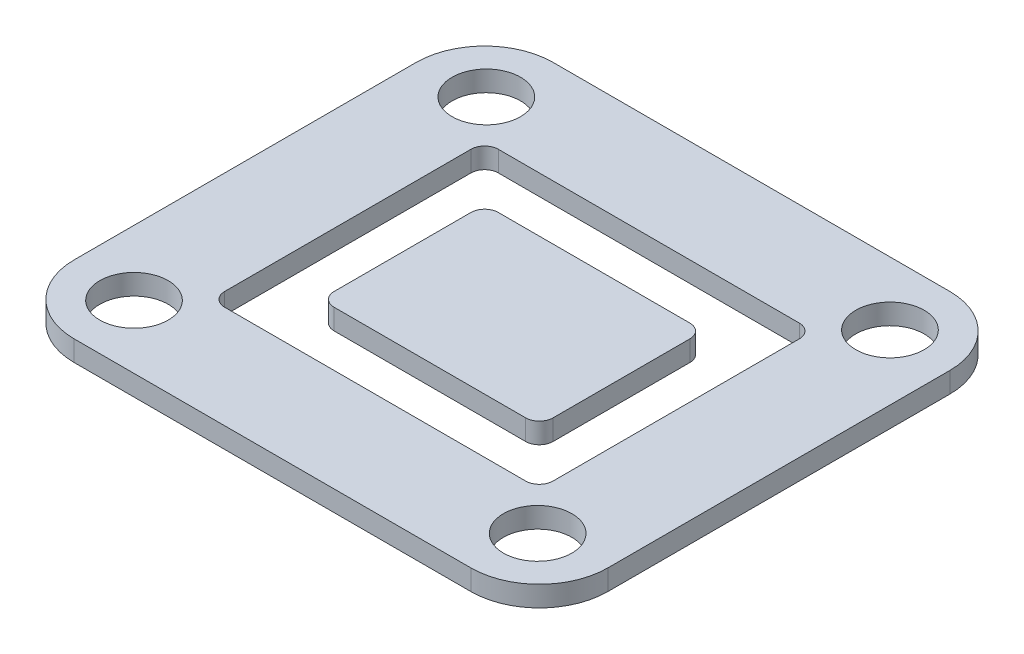
ISO-10303-21;
HEADER;
FILE_DESCRIPTION(('STEP AP214'),'2;1');
FILE_NAME('part.step','',(''),(''),'','','');
FILE_SCHEMA(('AUTOMOTIVE_DESIGN { 1 0 10303 214 1 1 1 1 }'));
ENDSEC;
DATA;
#1=APPLICATION_CONTEXT('core data for automotive mechanical design processes');
#2=APPLICATION_PROTOCOL_DEFINITION('international standard','automotive_design',2000,#1);
#3=PRODUCT_CONTEXT('',#1,'mechanical');
#4=PRODUCT('Part','Part','',(#3));
#5=PRODUCT_RELATED_PRODUCT_CATEGORY('part','',(#4));
#6=PRODUCT_DEFINITION_FORMATION('','',#4);
#7=PRODUCT_DEFINITION_CONTEXT('part definition',#1,'design');
#8=PRODUCT_DEFINITION('design','',#6,#7);
#9=PRODUCT_DEFINITION_SHAPE('','',#8);
#10=(LENGTH_UNIT() NAMED_UNIT(*) SI_UNIT(.MILLI.,.METRE.));
#11=(NAMED_UNIT(*) PLANE_ANGLE_UNIT() SI_UNIT($,.RADIAN.));
#12=(NAMED_UNIT(*) SI_UNIT($,.STERADIAN.) SOLID_ANGLE_UNIT());
#13=UNCERTAINTY_MEASURE_WITH_UNIT(LENGTH_MEASURE(1.E-05),#10,'distance_accuracy_value','');
#14=(GEOMETRIC_REPRESENTATION_CONTEXT(3) GLOBAL_UNCERTAINTY_ASSIGNED_CONTEXT((#13)) GLOBAL_UNIT_ASSIGNED_CONTEXT((#10,
#11,#12)) REPRESENTATION_CONTEXT('',''));
#15=CARTESIAN_POINT('',(0.,0.,0.));
#16=DIRECTION('',(0.,0.,1.));
#17=DIRECTION('',(1.,0.,0.));
#18=AXIS2_PLACEMENT_3D('',#15,#16,#17);
#19=CARTESIAN_POINT('',(0.,3.,-16.9501900989278));
#20=DIRECTION('',(0.,0.,1.));
#21=DIRECTION('',(1.,0.,0.));
#22=AXIS2_PLACEMENT_3D('',#19,#20,#21);
#23=PLANE('',#22);
#24=DIRECTION('',(-1.,0.,0.));
#25=VECTOR('',#24,1.);
#26=CARTESIAN_POINT('',(0.,0.,-16.9501900989278));
#27=LINE('',#26,#25);
#28=CARTESIAN_POINT('',(13.9246009024166,0.,-16.9501900989278));
#29=VERTEX_POINT('',#28);
#30=CARTESIAN_POINT('',(-14.0753990975834,0.,-16.9501900989278));
#31=VERTEX_POINT('',#30);
#32=EDGE_CURVE('E193',#29,#31,#27,.T.);
#33=ORIENTED_EDGE('',*,*,#32,.T.);
#34=DIRECTION('',(0.,-1.,0.));
#35=VECTOR('',#34,1.);
#36=CARTESIAN_POINT('',(-14.0753990975834,3.,-16.9501900989278));
#37=LINE('',#36,#35);
#38=CARTESIAN_POINT('',(-14.0753990975834,3.,-16.9501900989278));
#39=VERTEX_POINT('',#38);
#40=EDGE_CURVE('E180',#31,#39,#37,.F.);
#41=ORIENTED_EDGE('',*,*,#40,.T.);
#42=DIRECTION('',(-1.,0.,0.));
#43=VECTOR('',#42,1.);
#44=CARTESIAN_POINT('',(0.,3.,-16.9501900989278));
#45=LINE('',#44,#43);
#46=CARTESIAN_POINT('',(13.9246009024166,3.,-16.9501900989278));
#47=VERTEX_POINT('',#46);
#48=EDGE_CURVE('E195',#47,#39,#45,.T.);
#49=ORIENTED_EDGE('',*,*,#48,.F.);
#50=DIRECTION('',(0.,-1.,0.));
#51=VECTOR('',#50,1.);
#52=CARTESIAN_POINT('',(13.9246009024166,0.,-16.9501900989278));
#53=LINE('',#52,#51);
#54=EDGE_CURVE('E177',#47,#29,#53,.T.);
#55=ORIENTED_EDGE('',*,*,#54,.T.);
#56=EDGE_LOOP('',(#33,#41,#49,#55));
#57=FACE_BOUND('',#56,.T.);
#58=ADVANCED_FACE('F68',(#57),#23,.F.);
#59=CARTESIAN_POINT('',(-16.0753990975834,3.,0.));
#60=DIRECTION('',(1.,0.,0.));
#61=DIRECTION('',(0.,0.,-1.));
#62=AXIS2_PLACEMENT_3D('',#59,#60,#61);
#63=PLANE('',#62);
#64=DIRECTION('',(0.,0.,1.));
#65=VECTOR('',#64,1.);
#66=CARTESIAN_POINT('',(-16.0753990975834,0.,0.));
#67=LINE('',#66,#65);
#68=CARTESIAN_POINT('',(-16.0753990975834,0.,-14.9501900989278));
#69=VERTEX_POINT('',#68);
#70=CARTESIAN_POINT('',(-16.0753990975834,0.,5.0498099010722));
#71=VERTEX_POINT('',#70);
#72=EDGE_CURVE('E151',#69,#71,#67,.T.);
#73=ORIENTED_EDGE('',*,*,#72,.T.);
#74=DIRECTION('',(0.,-1.,0.));
#75=VECTOR('',#74,1.);
#76=CARTESIAN_POINT('',(-16.0753990975834,3.,5.0498099010722));
#77=LINE('',#76,#75);
#78=CARTESIAN_POINT('',(-16.0753990975834,3.,5.0498099010722));
#79=VERTEX_POINT('',#78);
#80=EDGE_CURVE('E168',#71,#79,#77,.F.);
#81=ORIENTED_EDGE('',*,*,#80,.T.);
#82=DIRECTION('',(0.,0.,1.));
#83=VECTOR('',#82,1.);
#84=CARTESIAN_POINT('',(-16.0753990975834,3.,0.));
#85=LINE('',#84,#83);
#86=CARTESIAN_POINT('',(-16.0753990975834,3.,-14.9501900989278));
#87=VERTEX_POINT('',#86);
#88=EDGE_CURVE('E202',#87,#79,#85,.T.);
#89=ORIENTED_EDGE('',*,*,#88,.F.);
#90=DIRECTION('',(0.,-1.,0.));
#91=VECTOR('',#90,1.);
#92=CARTESIAN_POINT('',(-16.0753990975834,3.,-14.9501900989278));
#93=LINE('',#92,#91);
#94=EDGE_CURVE('E165',#87,#69,#93,.T.);
#95=ORIENTED_EDGE('',*,*,#94,.T.);
#96=EDGE_LOOP('',(#73,#81,#89,#95));
#97=FACE_BOUND('',#96,.T.);
#98=ADVANCED_FACE('F210',(#97),#63,.F.);
#99=CARTESIAN_POINT('',(0.,3.,7.0498099010722));
#100=DIRECTION('',(0.,0.,1.));
#101=DIRECTION('',(1.,0.,0.));
#102=AXIS2_PLACEMENT_3D('',#99,#100,#101);
#103=PLANE('',#102);
#104=DIRECTION('',(-1.,0.,0.));
#105=VECTOR('',#104,1.);
#106=CARTESIAN_POINT('',(0.,3.,7.0498099010722));
#107=LINE('',#106,#105);
#108=CARTESIAN_POINT('',(13.9246009024166,3.,7.04980990107219));
#109=VERTEX_POINT('',#108);
#110=CARTESIAN_POINT('',(-14.0753990975834,3.,7.0498099010722));
#111=VERTEX_POINT('',#110);
#112=EDGE_CURVE('E156',#109,#111,#107,.T.);
#113=ORIENTED_EDGE('',*,*,#112,.T.);
#114=DIRECTION('',(0.,-1.,0.));
#115=VECTOR('',#114,1.);
#116=CARTESIAN_POINT('',(-14.0753990975834,0.,7.0498099010722));
#117=LINE('',#116,#115);
#118=CARTESIAN_POINT('',(-14.0753990975834,0.,7.0498099010722));
#119=VERTEX_POINT('',#118);
#120=EDGE_CURVE('E143',#111,#119,#117,.T.);
#121=ORIENTED_EDGE('',*,*,#120,.T.);
#122=DIRECTION('',(-1.,0.,0.));
#123=VECTOR('',#122,1.);
#124=CARTESIAN_POINT('',(0.,0.,7.0498099010722));
#125=LINE('',#124,#123);
#126=CARTESIAN_POINT('',(13.9246009024166,0.,7.04980990107219));
#127=VERTEX_POINT('',#126);
#128=EDGE_CURVE('E136',#127,#119,#125,.T.);
#129=ORIENTED_EDGE('',*,*,#128,.F.);
#130=DIRECTION('',(0.,-1.,0.));
#131=VECTOR('',#130,1.);
#132=CARTESIAN_POINT('',(13.9246009024166,3.,7.04980990107219));
#133=LINE('',#132,#131);
#134=EDGE_CURVE('E149',#127,#109,#133,.F.);
#135=ORIENTED_EDGE('',*,*,#134,.T.);
#136=EDGE_LOOP('',(#113,#121,#129,#135));
#137=FACE_BOUND('',#136,.T.);
#138=ADVANCED_FACE('F148',(#137),#103,.T.);
#139=CARTESIAN_POINT('',(15.9246009024166,3.,0.));
#140=DIRECTION('',(1.,0.,0.));
#141=DIRECTION('',(0.,0.,-1.));
#142=AXIS2_PLACEMENT_3D('',#139,#140,#141);
#143=PLANE('',#142);
#144=DIRECTION('',(0.,0.,1.));
#145=VECTOR('',#144,1.);
#146=CARTESIAN_POINT('',(15.9246009024166,0.,0.));
#147=LINE('',#146,#145);
#148=CARTESIAN_POINT('',(15.9246009024166,0.,-14.9501900989278));
#149=VERTEX_POINT('',#148);
#150=CARTESIAN_POINT('',(15.9246009024166,0.,5.04980990107219));
#151=VERTEX_POINT('',#150);
#152=EDGE_CURVE('E137',#149,#151,#147,.T.);
#153=ORIENTED_EDGE('',*,*,#152,.F.);
#154=DIRECTION('',(0.,-1.,0.));
#155=VECTOR('',#154,1.);
#156=CARTESIAN_POINT('',(15.9246009024166,3.,-14.9501900989278));
#157=LINE('',#156,#155);
#158=CARTESIAN_POINT('',(15.9246009024166,3.,-14.9501900989278));
#159=VERTEX_POINT('',#158);
#160=EDGE_CURVE('E13',#149,#159,#157,.F.);
#161=ORIENTED_EDGE('',*,*,#160,.T.);
#162=DIRECTION('',(0.,0.,1.));
#163=VECTOR('',#162,1.);
#164=CARTESIAN_POINT('',(15.9246009024166,3.,0.));
#165=LINE('',#164,#163);
#166=CARTESIAN_POINT('',(15.9246009024166,3.,5.04980990107219));
#167=VERTEX_POINT('',#166);
#168=EDGE_CURVE('E153',#159,#167,#165,.T.);
#169=ORIENTED_EDGE('',*,*,#168,.T.);
#170=DIRECTION('',(0.,-1.,0.));
#171=VECTOR('',#170,1.);
#172=CARTESIAN_POINT('',(15.9246009024166,3.,5.04980990107219));
#173=LINE('',#172,#171);
#174=EDGE_CURVE('E76',#167,#151,#173,.T.);
#175=ORIENTED_EDGE('',*,*,#174,.T.);
#176=EDGE_LOOP('',(#153,#161,#169,#175));
#177=FACE_BOUND('',#176,.T.);
#178=ADVANCED_FACE('F181',(#177),#143,.T.);
#179=CARTESIAN_POINT('',(0.,3.,0.));
#180=DIRECTION('',(0.,1.,0.));
#181=DIRECTION('',(0.,0.,1.));
#182=AXIS2_PLACEMENT_3D('',#179,#180,#181);
#183=PLANE('',#182);
#184=ORIENTED_EDGE('',*,*,#88,.T.);
#185=CARTESIAN_POINT('',(-14.0753990975834,3.,5.0498099010722));
#186=DIRECTION('',(0.,1.,0.));
#187=DIRECTION('',(0.,0.,1.));
#188=AXIS2_PLACEMENT_3D('',#185,#186,#187);
#189=CIRCLE('',#188,2.);
#190=EDGE_CURVE('E175',#79,#111,#189,.T.);
#191=ORIENTED_EDGE('',*,*,#190,.T.);
#192=ORIENTED_EDGE('',*,*,#112,.F.);
#193=CARTESIAN_POINT('',(13.9246009024166,3.,5.04980990107219));
#194=DIRECTION('',(0.,1.,0.));
#195=DIRECTION('',(0.,0.,1.));
#196=AXIS2_PLACEMENT_3D('',#193,#194,#195);
#197=CIRCLE('',#196,2.);
#198=EDGE_CURVE('E83',#109,#167,#197,.T.);
#199=ORIENTED_EDGE('',*,*,#198,.T.);
#200=ORIENTED_EDGE('',*,*,#168,.F.);
#201=CARTESIAN_POINT('',(13.9246009024166,3.,-14.9501900989278));
#202=DIRECTION('',(0.,1.,0.));
#203=DIRECTION('',(0.,0.,1.));
#204=AXIS2_PLACEMENT_3D('',#201,#202,#203);
#205=CIRCLE('',#204,2.);
#206=EDGE_CURVE('E171',#159,#47,#205,.T.);
#207=ORIENTED_EDGE('',*,*,#206,.T.);
#208=ORIENTED_EDGE('',*,*,#48,.T.);
#209=CARTESIAN_POINT('',(-14.0753990975834,3.,-14.9501900989278));
#210=DIRECTION('',(0.,1.,0.));
#211=DIRECTION('',(0.,0.,1.));
#212=AXIS2_PLACEMENT_3D('',#209,#210,#211);
#213=CIRCLE('',#212,2.);
#214=EDGE_CURVE('E173',#39,#87,#213,.T.);
#215=ORIENTED_EDGE('',*,*,#214,.T.);
#216=EDGE_LOOP('',(#184,#191,#192,#199,#200,#207,#208,#215));
#217=FACE_BOUND('',#216,.T.);
#218=ADVANCED_FACE('F184',(#217),#183,.T.);
#219=CARTESIAN_POINT('',(0.,0.,0.));
#220=DIRECTION('',(0.,1.,0.));
#221=DIRECTION('',(0.,0.,1.));
#222=AXIS2_PLACEMENT_3D('',#219,#220,#221);
#223=PLANE('',#222);
#224=ORIENTED_EDGE('',*,*,#128,.T.);
#225=CARTESIAN_POINT('',(-14.0753990975834,0.,5.0498099010722));
#226=DIRECTION('',(0.,1.,0.));
#227=DIRECTION('',(0.,0.,1.));
#228=AXIS2_PLACEMENT_3D('',#225,#226,#227);
#229=CIRCLE('',#228,2.);
#230=EDGE_CURVE('E163',#119,#71,#229,.F.);
#231=ORIENTED_EDGE('',*,*,#230,.T.);
#232=ORIENTED_EDGE('',*,*,#72,.F.);
#233=CARTESIAN_POINT('',(-14.0753990975834,0.,-14.9501900989278));
#234=DIRECTION('',(0.,1.,0.));
#235=DIRECTION('',(0.,0.,1.));
#236=AXIS2_PLACEMENT_3D('',#233,#234,#235);
#237=CIRCLE('',#236,2.);
#238=EDGE_CURVE('E161',#69,#31,#237,.F.);
#239=ORIENTED_EDGE('',*,*,#238,.T.);
#240=ORIENTED_EDGE('',*,*,#32,.F.);
#241=CARTESIAN_POINT('',(13.9246009024166,0.,-14.9501900989278));
#242=DIRECTION('',(0.,1.,0.));
#243=DIRECTION('',(0.,0.,1.));
#244=AXIS2_PLACEMENT_3D('',#241,#242,#243);
#245=CIRCLE('',#244,2.);
#246=EDGE_CURVE('E142',#29,#149,#245,.F.);
#247=ORIENTED_EDGE('',*,*,#246,.T.);
#248=ORIENTED_EDGE('',*,*,#152,.T.);
#249=CARTESIAN_POINT('',(13.9246009024166,0.,5.04980990107219));
#250=DIRECTION('',(0.,1.,0.));
#251=DIRECTION('',(0.,0.,1.));
#252=AXIS2_PLACEMENT_3D('',#249,#250,#251);
#253=CIRCLE('',#252,2.);
#254=EDGE_CURVE('E133',#151,#127,#253,.F.);
#255=ORIENTED_EDGE('',*,*,#254,.T.);
#256=EDGE_LOOP('',(#224,#231,#232,#239,#240,#247,#248,#255));
#257=FACE_BOUND('',#256,.T.);
#258=ADVANCED_FACE('F135',(#257),#223,.F.);
#259=CARTESIAN_POINT('',(-14.0753990975834,3.,5.0498099010722));
#260=DIRECTION('',(0.,1.,0.));
#261=DIRECTION('',(0.,0.,1.));
#262=AXIS2_PLACEMENT_3D('',#259,#260,#261);
#263=CYLINDRICAL_SURFACE('',#262,2.);
#264=ORIENTED_EDGE('',*,*,#190,.F.);
#265=ORIENTED_EDGE('',*,*,#80,.F.);
#266=ORIENTED_EDGE('',*,*,#230,.F.);
#267=ORIENTED_EDGE('',*,*,#120,.F.);
#268=EDGE_LOOP('',(#264,#265,#266,#267));
#269=FACE_BOUND('',#268,.T.);
#270=ADVANCED_FACE('F214',(#269),#263,.T.);
#271=CARTESIAN_POINT('',(-14.0753990975834,3.,-14.9501900989278));
#272=DIRECTION('',(0.,-1.,0.));
#273=DIRECTION('',(0.,0.,-1.));
#274=AXIS2_PLACEMENT_3D('',#271,#272,#273);
#275=CYLINDRICAL_SURFACE('',#274,2.);
#276=ORIENTED_EDGE('',*,*,#214,.F.);
#277=ORIENTED_EDGE('',*,*,#40,.F.);
#278=ORIENTED_EDGE('',*,*,#238,.F.);
#279=ORIENTED_EDGE('',*,*,#94,.F.);
#280=EDGE_LOOP('',(#276,#277,#278,#279));
#281=FACE_BOUND('',#280,.T.);
#282=ADVANCED_FACE('F208',(#281),#275,.T.);
#283=CARTESIAN_POINT('',(13.9246009024166,3.,-14.9501900989278));
#284=DIRECTION('',(0.,1.,0.));
#285=DIRECTION('',(0.,0.,1.));
#286=AXIS2_PLACEMENT_3D('',#283,#284,#285);
#287=CYLINDRICAL_SURFACE('',#286,2.);
#288=ORIENTED_EDGE('',*,*,#206,.F.);
#289=ORIENTED_EDGE('',*,*,#160,.F.);
#290=ORIENTED_EDGE('',*,*,#246,.F.);
#291=ORIENTED_EDGE('',*,*,#54,.F.);
#292=EDGE_LOOP('',(#288,#289,#290,#291));
#293=FACE_BOUND('',#292,.T.);
#294=ADVANCED_FACE('F189',(#293),#287,.T.);
#295=CARTESIAN_POINT('',(13.9246009024166,3.,5.04980990107219));
#296=DIRECTION('',(0.,-1.,0.));
#297=DIRECTION('',(0.,0.,-1.));
#298=AXIS2_PLACEMENT_3D('',#295,#296,#297);
#299=CYLINDRICAL_SURFACE('',#298,2.);
#300=ORIENTED_EDGE('',*,*,#198,.F.);
#301=ORIENTED_EDGE('',*,*,#134,.F.);
#302=ORIENTED_EDGE('',*,*,#254,.F.);
#303=ORIENTED_EDGE('',*,*,#174,.F.);
#304=EDGE_LOOP('',(#300,#301,#302,#303));
#305=FACE_BOUND('',#304,.T.);
#306=ADVANCED_FACE('F70',(#305),#299,.T.);
#307=CLOSED_SHELL('',(#58,#98,#138,#178,#218,#258,#270,#282,#294,#306));
#308=MANIFOLD_SOLID_BREP('B2',#307);
#309=CARTESIAN_POINT('',(0.,3.,-24.9501900989278));
#310=DIRECTION('',(0.,0.,-1.));
#311=DIRECTION('',(-1.,0.,0.));
#312=AXIS2_PLACEMENT_3D('',#309,#310,#311);
#313=PLANE('',#312);
#314=DIRECTION('',(1.,0.,0.));
#315=VECTOR('',#314,1.);
#316=CARTESIAN_POINT('',(0.,0.,-24.9501900989278));
#317=LINE('',#316,#315);
#318=CARTESIAN_POINT('',(-22.0753990975834,0.,-24.9501900989278));
#319=VERTEX_POINT('',#318);
#320=CARTESIAN_POINT('',(21.9246009024166,0.,-24.9501900989278));
#321=VERTEX_POINT('',#320);
#322=EDGE_CURVE('E414',#319,#321,#317,.T.);
#323=ORIENTED_EDGE('',*,*,#322,.T.);
#324=DIRECTION('',(0.,-1.,0.));
#325=VECTOR('',#324,1.);
#326=CARTESIAN_POINT('',(21.9246009024166,3.,-24.9501900989278));
#327=LINE('',#326,#325);
#328=CARTESIAN_POINT('',(21.9246009024166,3.,-24.9501900989278));
#329=VERTEX_POINT('',#328);
#330=EDGE_CURVE('E454',#321,#329,#327,.F.);
#331=ORIENTED_EDGE('',*,*,#330,.T.);
#332=DIRECTION('',(1.,0.,0.));
#333=VECTOR('',#332,1.);
#334=CARTESIAN_POINT('',(0.,3.,-24.9501900989278));
#335=LINE('',#334,#333);
#336=CARTESIAN_POINT('',(-22.0753990975834,3.,-24.9501900989278));
#337=VERTEX_POINT('',#336);
#338=EDGE_CURVE('E547',#337,#329,#335,.T.);
#339=ORIENTED_EDGE('',*,*,#338,.F.);
#340=DIRECTION('',(0.,-1.,0.));
#341=VECTOR('',#340,1.);
#342=CARTESIAN_POINT('',(-22.0753990975834,3.,-24.9501900989278));
#343=LINE('',#342,#341);
#344=EDGE_CURVE('E452',#337,#319,#343,.T.);
#345=ORIENTED_EDGE('',*,*,#344,.T.);
#346=EDGE_LOOP('',(#323,#331,#339,#345));
#347=FACE_BOUND('',#346,.T.);
#348=ADVANCED_FACE('F295',(#347),#313,.F.);
#349=CARTESIAN_POINT('',(23.9246009024166,3.,0.));
#350=DIRECTION('',(1.,0.,0.));
#351=DIRECTION('',(0.,0.,-1.));
#352=AXIS2_PLACEMENT_3D('',#349,#350,#351);
#353=PLANE('',#352);
#354=DIRECTION('',(0.,0.,1.));
#355=VECTOR('',#354,1.);
#356=CARTESIAN_POINT('',(23.9246009024166,0.,0.));
#357=LINE('',#356,#355);
#358=CARTESIAN_POINT('',(23.9246009024166,0.,-22.9501900989278));
#359=VERTEX_POINT('',#358);
#360=CARTESIAN_POINT('',(23.9246009024166,0.,13.0498099010722));
#361=VERTEX_POINT('',#360);
#362=EDGE_CURVE('E527',#359,#361,#357,.T.);
#363=ORIENTED_EDGE('',*,*,#362,.T.);
#364=DIRECTION('',(0.,-1.,0.));
#365=VECTOR('',#364,1.);
#366=CARTESIAN_POINT('',(23.9246009024166,3.,13.0498099010722));
#367=LINE('',#366,#365);
#368=CARTESIAN_POINT('',(23.9246009024166,3.,13.0498099010722));
#369=VERTEX_POINT('',#368);
#370=EDGE_CURVE('E450',#361,#369,#367,.F.);
#371=ORIENTED_EDGE('',*,*,#370,.T.);
#372=DIRECTION('',(0.,0.,1.));
#373=VECTOR('',#372,1.);
#374=CARTESIAN_POINT('',(23.9246009024166,3.,0.));
#375=LINE('',#374,#373);
#376=CARTESIAN_POINT('',(23.9246009024166,3.,-22.9501900989278));
#377=VERTEX_POINT('',#376);
#378=EDGE_CURVE('E545',#377,#369,#375,.T.);
#379=ORIENTED_EDGE('',*,*,#378,.F.);
#380=DIRECTION('',(0.,-1.,0.));
#381=VECTOR('',#380,1.);
#382=CARTESIAN_POINT('',(23.9246009024166,0.,-22.9501900989278));
#383=LINE('',#382,#381);
#384=EDGE_CURVE('E447',#377,#359,#383,.T.);
#385=ORIENTED_EDGE('',*,*,#384,.T.);
#386=EDGE_LOOP('',(#363,#371,#379,#385));
#387=FACE_BOUND('',#386,.T.);
#388=ADVANCED_FACE('F579',(#387),#353,.F.);
#389=CARTESIAN_POINT('',(0.,3.,15.0498099010722));
#390=DIRECTION('',(0.,0.,-1.));
#391=DIRECTION('',(-1.,0.,0.));
#392=AXIS2_PLACEMENT_3D('',#389,#390,#391);
#393=PLANE('',#392);
#394=DIRECTION('',(1.,0.,0.));
#395=VECTOR('',#394,1.);
#396=CARTESIAN_POINT('',(0.,0.,15.0498099010722));
#397=LINE('',#396,#395);
#398=CARTESIAN_POINT('',(-22.0753990975834,0.,15.0498099010722));
#399=VERTEX_POINT('',#398);
#400=CARTESIAN_POINT('',(21.9246009024166,0.,15.0498099010722));
#401=VERTEX_POINT('',#400);
#402=EDGE_CURVE('E431',#399,#401,#397,.T.);
#403=ORIENTED_EDGE('',*,*,#402,.F.);
#404=DIRECTION('',(0.,-1.,0.));
#405=VECTOR('',#404,1.);
#406=CARTESIAN_POINT('',(-22.0753990975834,3.,15.0498099010722));
#407=LINE('',#406,#405);
#408=CARTESIAN_POINT('',(-22.0753990975834,3.,15.0498099010722));
#409=VERTEX_POINT('',#408);
#410=EDGE_CURVE('E445',#399,#409,#407,.F.);
#411=ORIENTED_EDGE('',*,*,#410,.T.);
#412=DIRECTION('',(1.,0.,0.));
#413=VECTOR('',#412,1.);
#414=CARTESIAN_POINT('',(0.,3.,15.0498099010722));
#415=LINE('',#414,#413);
#416=CARTESIAN_POINT('',(21.9246009024166,3.,15.0498099010722));
#417=VERTEX_POINT('',#416);
#418=EDGE_CURVE('E439',#409,#417,#415,.T.);
#419=ORIENTED_EDGE('',*,*,#418,.T.);
#420=DIRECTION('',(0.,-1.,0.));
#421=VECTOR('',#420,1.);
#422=CARTESIAN_POINT('',(21.9246009024166,3.,15.0498099010722));
#423=LINE('',#422,#421);
#424=EDGE_CURVE('E437',#417,#401,#423,.T.);
#425=ORIENTED_EDGE('',*,*,#424,.T.);
#426=EDGE_LOOP('',(#403,#411,#419,#425));
#427=FACE_BOUND('',#426,.T.);
#428=ADVANCED_FACE('F534',(#427),#393,.T.);
#429=CARTESIAN_POINT('',(38.9246009024166,3.,0.));
#430=DIRECTION('',(1.,0.,0.));
#431=DIRECTION('',(0.,0.,-1.));
#432=AXIS2_PLACEMENT_3D('',#429,#430,#431);
#433=PLANE('',#432);
#434=DIRECTION('',(0.,0.,1.));
#435=VECTOR('',#434,1.);
#436=CARTESIAN_POINT('',(38.9246009024166,0.,0.));
#437=LINE('',#436,#435);
#438=CARTESIAN_POINT('',(38.9246009024166,0.,-29.9501900989278));
#439=VERTEX_POINT('',#438);
#440=CARTESIAN_POINT('',(38.9246009024166,0.,20.0498099010722));
#441=VERTEX_POINT('',#440);
#442=EDGE_CURVE('E503',#439,#441,#437,.T.);
#443=ORIENTED_EDGE('',*,*,#442,.F.);
#444=DIRECTION('',(0.,-1.,0.));
#445=VECTOR('',#444,1.);
#446=CARTESIAN_POINT('',(38.9246009024166,3.,-29.9501900989278));
#447=LINE('',#446,#445);
#448=CARTESIAN_POINT('',(38.9246009024166,3.,-29.9501900989278));
#449=VERTEX_POINT('',#448);
#450=EDGE_CURVE('E66',#439,#449,#447,.F.);
#451=ORIENTED_EDGE('',*,*,#450,.T.);
#452=DIRECTION('',(0.,0.,1.));
#453=VECTOR('',#452,1.);
#454=CARTESIAN_POINT('',(38.9246009024166,3.,0.));
#455=LINE('',#454,#453);
#456=CARTESIAN_POINT('',(38.9246009024166,3.,20.0498099010722));
#457=VERTEX_POINT('',#456);
#458=EDGE_CURVE('E505',#449,#457,#455,.T.);
#459=ORIENTED_EDGE('',*,*,#458,.T.);
#460=DIRECTION('',(0.,-1.,0.));
#461=VECTOR('',#460,1.);
#462=CARTESIAN_POINT('',(38.9246009024166,0.,20.0498099010722));
#463=LINE('',#462,#461);
#464=EDGE_CURVE('E303',#457,#441,#463,.T.);
#465=ORIENTED_EDGE('',*,*,#464,.T.);
#466=EDGE_LOOP('',(#443,#451,#459,#465));
#467=FACE_BOUND('',#466,.T.);
#468=ADVANCED_FACE('F502',(#467),#433,.T.);
#469=CARTESIAN_POINT('',(0.,3.,-39.9501900989278));
#470=DIRECTION('',(0.,0.,-1.));
#471=DIRECTION('',(-1.,0.,0.));
#472=AXIS2_PLACEMENT_3D('',#469,#470,#471);
#473=PLANE('',#472);
#474=DIRECTION('',(1.,0.,0.));
#475=VECTOR('',#474,1.);
#476=CARTESIAN_POINT('',(0.,0.,-39.9501900989278));
#477=LINE('',#476,#475);
#478=CARTESIAN_POINT('',(-29.0753990975834,0.,-39.9501900989278));
#479=VERTEX_POINT('',#478);
#480=CARTESIAN_POINT('',(28.9246009024166,0.,-39.9501900989278));
#481=VERTEX_POINT('',#480);
#482=EDGE_CURVE('E512',#479,#481,#477,.T.);
#483=ORIENTED_EDGE('',*,*,#482,.F.);
#484=DIRECTION('',(0.,-1.,0.));
#485=VECTOR('',#484,1.);
#486=CARTESIAN_POINT('',(-29.0753990975834,3.,-39.9501900989278));
#487=LINE('',#486,#485);
#488=CARTESIAN_POINT('',(-29.0753990975834,3.,-39.9501900989278));
#489=VERTEX_POINT('',#488);
#490=EDGE_CURVE('E317',#479,#489,#487,.F.);
#491=ORIENTED_EDGE('',*,*,#490,.T.);
#492=DIRECTION('',(1.,0.,0.));
#493=VECTOR('',#492,1.);
#494=CARTESIAN_POINT('',(0.,3.,-39.9501900989278));
#495=LINE('',#494,#493);
#496=CARTESIAN_POINT('',(28.9246009024166,3.,-39.9501900989278));
#497=VERTEX_POINT('',#496);
#498=EDGE_CURVE('E637',#489,#497,#495,.T.);
#499=ORIENTED_EDGE('',*,*,#498,.T.);
#500=DIRECTION('',(0.,-1.,0.));
#501=VECTOR('',#500,1.);
#502=CARTESIAN_POINT('',(28.9246009024166,3.,-39.9501900989278));
#503=LINE('',#502,#501);
#504=EDGE_CURVE('E493',#497,#481,#503,.T.);
#505=ORIENTED_EDGE('',*,*,#504,.T.);
#506=EDGE_LOOP('',(#483,#491,#499,#505));
#507=FACE_BOUND('',#506,.T.);
#508=ADVANCED_FACE('F595',(#507),#473,.T.);
#509=CARTESIAN_POINT('',(-39.0753990975834,3.,0.));
#510=DIRECTION('',(1.,0.,0.));
#511=DIRECTION('',(0.,0.,-1.));
#512=AXIS2_PLACEMENT_3D('',#509,#510,#511);
#513=PLANE('',#512);
#514=DIRECTION('',(0.,0.,1.));
#515=VECTOR('',#514,1.);
#516=CARTESIAN_POINT('',(-39.0753990975834,0.,0.));
#517=LINE('',#516,#515);
#518=CARTESIAN_POINT('',(-39.0753990975834,0.,-29.9501900989278));
#519=VERTEX_POINT('',#518);
#520=CARTESIAN_POINT('',(-39.0753990975834,0.,20.0498099010722));
#521=VERTEX_POINT('',#520);
#522=EDGE_CURVE('E515',#519,#521,#517,.T.);
#523=ORIENTED_EDGE('',*,*,#522,.T.);
#524=DIRECTION('',(0.,-1.,0.));
#525=VECTOR('',#524,1.);
#526=CARTESIAN_POINT('',(-39.0753990975834,3.,20.0498099010722));
#527=LINE('',#526,#525);
#528=CARTESIAN_POINT('',(-39.0753990975834,3.,20.0498099010722));
#529=VERTEX_POINT('',#528);
#530=EDGE_CURVE('E484',#521,#529,#527,.F.);
#531=ORIENTED_EDGE('',*,*,#530,.T.);
#532=DIRECTION('',(0.,0.,1.));
#533=VECTOR('',#532,1.);
#534=CARTESIAN_POINT('',(-39.0753990975834,3.,0.));
#535=LINE('',#534,#533);
#536=CARTESIAN_POINT('',(-39.0753990975834,3.,-29.9501900989278));
#537=VERTEX_POINT('',#536);
#538=EDGE_CURVE('E630',#537,#529,#535,.T.);
#539=ORIENTED_EDGE('',*,*,#538,.F.);
#540=DIRECTION('',(0.,-1.,0.));
#541=VECTOR('',#540,1.);
#542=CARTESIAN_POINT('',(-39.0753990975834,0.,-29.9501900989278));
#543=LINE('',#542,#541);
#544=EDGE_CURVE('E481',#537,#519,#543,.T.);
#545=ORIENTED_EDGE('',*,*,#544,.T.);
#546=EDGE_LOOP('',(#523,#531,#539,#545));
#547=FACE_BOUND('',#546,.T.);
#548=ADVANCED_FACE('F591',(#547),#513,.F.);
#549=CARTESIAN_POINT('',(0.,3.,30.0498099010722));
#550=DIRECTION('',(0.,0.,-1.));
#551=DIRECTION('',(-1.,0.,0.));
#552=AXIS2_PLACEMENT_3D('',#549,#550,#551);
#553=PLANE('',#552);
#554=DIRECTION('',(1.,0.,0.));
#555=VECTOR('',#554,1.);
#556=CARTESIAN_POINT('',(0.,3.,30.0498099010722));
#557=LINE('',#556,#555);
#558=CARTESIAN_POINT('',(-29.0753990975834,3.,30.0498099010722));
#559=VERTEX_POINT('',#558);
#560=CARTESIAN_POINT('',(28.9246009024166,3.,30.0498099010722));
#561=VERTEX_POINT('',#560);
#562=EDGE_CURVE('E636',#559,#561,#557,.T.);
#563=ORIENTED_EDGE('',*,*,#562,.F.);
#564=DIRECTION('',(0.,-1.,0.));
#565=VECTOR('',#564,1.);
#566=CARTESIAN_POINT('',(-29.0753990975834,3.,30.0498099010722));
#567=LINE('',#566,#565);
#568=CARTESIAN_POINT('',(-29.0753990975834,0.,30.0498099010722));
#569=VERTEX_POINT('',#568);
#570=EDGE_CURVE('E470',#559,#569,#567,.T.);
#571=ORIENTED_EDGE('',*,*,#570,.T.);
#572=DIRECTION('',(1.,0.,0.));
#573=VECTOR('',#572,1.);
#574=CARTESIAN_POINT('',(0.,0.,30.0498099010722));
#575=LINE('',#574,#573);
#576=CARTESIAN_POINT('',(28.9246009024166,0.,30.0498099010722));
#577=VERTEX_POINT('',#576);
#578=EDGE_CURVE('E524',#569,#577,#575,.T.);
#579=ORIENTED_EDGE('',*,*,#578,.T.);
#580=DIRECTION('',(0.,-1.,0.));
#581=VECTOR('',#580,1.);
#582=CARTESIAN_POINT('',(28.9246009024166,3.,30.0498099010722));
#583=LINE('',#582,#581);
#584=EDGE_CURVE('E468',#577,#561,#583,.F.);
#585=ORIENTED_EDGE('',*,*,#584,.T.);
#586=EDGE_LOOP('',(#563,#571,#579,#585));
#587=FACE_BOUND('',#586,.T.);
#588=ADVANCED_FACE('F574',(#587),#553,.F.);
#589=CARTESIAN_POINT('',(-29.5753990975834,3.,20.7998099010722));
#590=DIRECTION('',(0.,-1.,0.));
#591=DIRECTION('',(0.,0.,-1.));
#592=AXIS2_PLACEMENT_3D('',#589,#590,#591);
#593=CYLINDRICAL_SURFACE('',#592,5.);
#594=CARTESIAN_POINT('',(-29.5753990975834,3.,20.7998099010722));
#595=DIRECTION('',(0.,1.,0.));
#596=DIRECTION('',(0.,0.,1.));
#597=AXIS2_PLACEMENT_3D('',#594,#595,#596);
#598=CIRCLE('',#597,5.);
#599=CARTESIAN_POINT('',(-29.5753990975834,3.,25.7998099010722));
#600=VERTEX_POINT('',#599);
#601=EDGE_CURVE('E627',#600,#600,#598,.T.);
#602=ORIENTED_EDGE('',*,*,#601,.T.);
#603=EDGE_LOOP('',(#602));
#604=FACE_BOUND('',#603,.T.);
#605=CARTESIAN_POINT('',(-29.5753990975834,0.,20.7998099010722));
#606=DIRECTION('',(0.,1.,0.));
#607=DIRECTION('',(0.,0.,1.));
#608=AXIS2_PLACEMENT_3D('',#605,#606,#607);
#609=CIRCLE('',#608,5.);
#610=CARTESIAN_POINT('',(-29.5753990975834,0.,25.7998099010722));
#611=VERTEX_POINT('',#610);
#612=EDGE_CURVE('E513',#611,#611,#609,.T.);
#613=ORIENTED_EDGE('',*,*,#612,.F.);
#614=EDGE_LOOP('',(#613));
#615=FACE_BOUND('',#614,.T.);
#616=ADVANCED_FACE('F564',(#604,#615),#593,.F.);
#617=CARTESIAN_POINT('',(-29.5753990975834,3.,-30.7001900989278));
#618=DIRECTION('',(0.,-1.,0.));
#619=DIRECTION('',(0.,0.,-1.));
#620=AXIS2_PLACEMENT_3D('',#617,#618,#619);
#621=CYLINDRICAL_SURFACE('',#620,5.);
#622=CARTESIAN_POINT('',(-29.5753990975834,3.,-30.7001900989278));
#623=DIRECTION('',(0.,1.,0.));
#624=DIRECTION('',(0.,0.,1.));
#625=AXIS2_PLACEMENT_3D('',#622,#623,#624);
#626=CIRCLE('',#625,5.);
#627=CARTESIAN_POINT('',(-29.5753990975834,3.,-25.7001900989278));
#628=VERTEX_POINT('',#627);
#629=EDGE_CURVE('E624',#628,#628,#626,.T.);
#630=ORIENTED_EDGE('',*,*,#629,.T.);
#631=EDGE_LOOP('',(#630));
#632=FACE_BOUND('',#631,.T.);
#633=CARTESIAN_POINT('',(-29.5753990975834,0.,-30.7001900989278));
#634=DIRECTION('',(0.,1.,0.));
#635=DIRECTION('',(0.,0.,1.));
#636=AXIS2_PLACEMENT_3D('',#633,#634,#635);
#637=CIRCLE('',#636,5.);
#638=CARTESIAN_POINT('',(-29.5753990975834,0.,-25.7001900989278));
#639=VERTEX_POINT('',#638);
#640=EDGE_CURVE('E518',#639,#639,#637,.T.);
#641=ORIENTED_EDGE('',*,*,#640,.F.);
#642=EDGE_LOOP('',(#641));
#643=FACE_BOUND('',#642,.T.);
#644=ADVANCED_FACE('F561',(#632,#643),#621,.F.);
#645=CARTESIAN_POINT('',(29.4246009024166,3.,-30.7001900989278));
#646=DIRECTION('',(0.,-1.,0.));
#647=DIRECTION('',(0.,0.,-1.));
#648=AXIS2_PLACEMENT_3D('',#645,#646,#647);
#649=CYLINDRICAL_SURFACE('',#648,5.);
#650=CARTESIAN_POINT('',(29.4246009024166,3.,-30.7001900989278));
#651=DIRECTION('',(0.,1.,0.));
#652=DIRECTION('',(0.,0.,1.));
#653=AXIS2_PLACEMENT_3D('',#650,#651,#652);
#654=CIRCLE('',#653,5.);
#655=CARTESIAN_POINT('',(29.4246009024166,3.,-25.7001900989278));
#656=VERTEX_POINT('',#655);
#657=EDGE_CURVE('E621',#656,#656,#654,.T.);
#658=ORIENTED_EDGE('',*,*,#657,.T.);
#659=EDGE_LOOP('',(#658));
#660=FACE_BOUND('',#659,.T.);
#661=CARTESIAN_POINT('',(29.4246009024166,0.,-30.7001900989278));
#662=DIRECTION('',(0.,1.,0.));
#663=DIRECTION('',(0.,0.,1.));
#664=AXIS2_PLACEMENT_3D('',#661,#662,#663);
#665=CIRCLE('',#664,5.);
#666=CARTESIAN_POINT('',(29.4246009024166,0.,-25.7001900989278));
#667=VERTEX_POINT('',#666);
#668=EDGE_CURVE('E554',#667,#667,#665,.T.);
#669=ORIENTED_EDGE('',*,*,#668,.F.);
#670=EDGE_LOOP('',(#669));
#671=FACE_BOUND('',#670,.T.);
#672=ADVANCED_FACE('F563',(#660,#671),#649,.F.);
#673=CARTESIAN_POINT('',(29.4246009024166,3.,20.7998099010722));
#674=DIRECTION('',(0.,-1.,0.));
#675=DIRECTION('',(0.,0.,-1.));
#676=AXIS2_PLACEMENT_3D('',#673,#674,#675);
#677=CYLINDRICAL_SURFACE('',#676,5.);
#678=CARTESIAN_POINT('',(29.4246009024166,3.,20.7998099010722));
#679=DIRECTION('',(0.,1.,0.));
#680=DIRECTION('',(0.,0.,1.));
#681=AXIS2_PLACEMENT_3D('',#678,#679,#680);
#682=CIRCLE('',#681,5.);
#683=CARTESIAN_POINT('',(29.4246009024166,3.,25.7998099010722));
#684=VERTEX_POINT('',#683);
#685=EDGE_CURVE('E430',#684,#684,#682,.T.);
#686=ORIENTED_EDGE('',*,*,#685,.T.);
#687=EDGE_LOOP('',(#686));
#688=FACE_BOUND('',#687,.T.);
#689=CARTESIAN_POINT('',(29.4246009024166,0.,20.7998099010722));
#690=DIRECTION('',(0.,1.,0.));
#691=DIRECTION('',(0.,0.,1.));
#692=AXIS2_PLACEMENT_3D('',#689,#690,#691);
#693=CIRCLE('',#692,5.);
#694=CARTESIAN_POINT('',(29.4246009024166,0.,25.7998099010722));
#695=VERTEX_POINT('',#694);
#696=EDGE_CURVE('E551',#695,#695,#693,.T.);
#697=ORIENTED_EDGE('',*,*,#696,.F.);
#698=EDGE_LOOP('',(#697));
#699=FACE_BOUND('',#698,.T.);
#700=ADVANCED_FACE('F571',(#688,#699),#677,.F.);
#701=CARTESIAN_POINT('',(-24.0753990975834,3.,0.));
#702=DIRECTION('',(1.,0.,0.));
#703=DIRECTION('',(0.,0.,-1.));
#704=AXIS2_PLACEMENT_3D('',#701,#702,#703);
#705=PLANE('',#704);
#706=DIRECTION('',(0.,0.,1.));
#707=VECTOR('',#706,1.);
#708=CARTESIAN_POINT('',(-24.0753990975834,3.,0.));
#709=LINE('',#708,#707);
#710=CARTESIAN_POINT('',(-24.0753990975834,3.,-22.9501900989278));
#711=VERTEX_POINT('',#710);
#712=CARTESIAN_POINT('',(-24.0753990975834,3.,13.0498099010722));
#713=VERTEX_POINT('',#712);
#714=EDGE_CURVE('E435',#711,#713,#709,.T.);
#715=ORIENTED_EDGE('',*,*,#714,.T.);
#716=DIRECTION('',(0.,-1.,0.));
#717=VECTOR('',#716,1.);
#718=CARTESIAN_POINT('',(-24.0753990975834,0.,13.0498099010722));
#719=LINE('',#718,#717);
#720=CARTESIAN_POINT('',(-24.0753990975834,0.,13.0498099010722));
#721=VERTEX_POINT('',#720);
#722=EDGE_CURVE('E429',#713,#721,#719,.T.);
#723=ORIENTED_EDGE('',*,*,#722,.T.);
#724=DIRECTION('',(0.,0.,1.));
#725=VECTOR('',#724,1.);
#726=CARTESIAN_POINT('',(-24.0753990975834,0.,0.));
#727=LINE('',#726,#725);
#728=CARTESIAN_POINT('',(-24.0753990975834,0.,-22.9501900989278));
#729=VERTEX_POINT('',#728);
#730=EDGE_CURVE('E412',#729,#721,#727,.T.);
#731=ORIENTED_EDGE('',*,*,#730,.F.);
#732=DIRECTION('',(0.,-1.,0.));
#733=VECTOR('',#732,1.);
#734=CARTESIAN_POINT('',(-24.0753990975834,3.,-22.9501900989278));
#735=LINE('',#734,#733);
#736=EDGE_CURVE('E426',#729,#711,#735,.F.);
#737=ORIENTED_EDGE('',*,*,#736,.T.);
#738=EDGE_LOOP('',(#715,#723,#731,#737));
#739=FACE_BOUND('',#738,.T.);
#740=ADVANCED_FACE('F425',(#739),#705,.T.);
#741=CARTESIAN_POINT('',(0.,3.,0.));
#742=DIRECTION('',(0.,1.,0.));
#743=DIRECTION('',(0.,0.,1.));
#744=AXIS2_PLACEMENT_3D('',#741,#742,#743);
#745=PLANE('',#744);
#746=ORIENTED_EDGE('',*,*,#685,.F.);
#747=EDGE_LOOP('',(#746));
#748=FACE_BOUND('',#747,.T.);
#749=ORIENTED_EDGE('',*,*,#657,.F.);
#750=EDGE_LOOP('',(#749));
#751=FACE_BOUND('',#750,.T.);
#752=ORIENTED_EDGE('',*,*,#629,.F.);
#753=EDGE_LOOP('',(#752));
#754=FACE_BOUND('',#753,.T.);
#755=ORIENTED_EDGE('',*,*,#601,.F.);
#756=EDGE_LOOP('',(#755));
#757=FACE_BOUND('',#756,.T.);
#758=ORIENTED_EDGE('',*,*,#538,.T.);
#759=CARTESIAN_POINT('',(-29.0753990975834,3.,20.0498099010722));
#760=DIRECTION('',(0.,1.,0.));
#761=DIRECTION('',(0.,0.,1.));
#762=AXIS2_PLACEMENT_3D('',#759,#760,#761);
#763=CIRCLE('',#762,10.);
#764=EDGE_CURVE('E491',#529,#559,#763,.T.);
#765=ORIENTED_EDGE('',*,*,#764,.T.);
#766=ORIENTED_EDGE('',*,*,#562,.T.);
#767=CARTESIAN_POINT('',(28.9246009024166,3.,20.0498099010722));
#768=DIRECTION('',(0.,1.,0.));
#769=DIRECTION('',(0.,0.,1.));
#770=AXIS2_PLACEMENT_3D('',#767,#768,#769);
#771=CIRCLE('',#770,10.);
#772=EDGE_CURVE('E486',#561,#457,#771,.T.);
#773=ORIENTED_EDGE('',*,*,#772,.T.);
#774=ORIENTED_EDGE('',*,*,#458,.F.);
#775=CARTESIAN_POINT('',(28.9246009024166,3.,-29.9501900989278));
#776=DIRECTION('',(0.,1.,0.));
#777=DIRECTION('',(0.,0.,1.));
#778=AXIS2_PLACEMENT_3D('',#775,#776,#777);
#779=CIRCLE('',#778,10.);
#780=EDGE_CURVE('E310',#449,#497,#779,.T.);
#781=ORIENTED_EDGE('',*,*,#780,.T.);
#782=ORIENTED_EDGE('',*,*,#498,.F.);
#783=CARTESIAN_POINT('',(-29.0753990975834,3.,-29.9501900989278));
#784=DIRECTION('',(0.,1.,0.));
#785=DIRECTION('',(0.,0.,1.));
#786=AXIS2_PLACEMENT_3D('',#783,#784,#785);
#787=CIRCLE('',#786,10.);
#788=EDGE_CURVE('E489',#489,#537,#787,.T.);
#789=ORIENTED_EDGE('',*,*,#788,.T.);
#790=EDGE_LOOP('',(#758,#765,#766,#773,#774,#781,#782,#789));
#791=FACE_BOUND('',#790,.T.);
#792=ORIENTED_EDGE('',*,*,#714,.F.);
#793=CARTESIAN_POINT('',(-22.0753990975834,3.,-22.9501900989278));
#794=DIRECTION('',(0.,1.,0.));
#795=DIRECTION('',(0.,0.,1.));
#796=AXIS2_PLACEMENT_3D('',#793,#794,#795);
#797=CIRCLE('',#796,2.);
#798=EDGE_CURVE('E419',#711,#337,#797,.F.);
#799=ORIENTED_EDGE('',*,*,#798,.T.);
#800=ORIENTED_EDGE('',*,*,#338,.T.);
#801=CARTESIAN_POINT('',(21.9246009024166,3.,-22.9501900989278));
#802=DIRECTION('',(0.,1.,0.));
#803=DIRECTION('',(0.,0.,1.));
#804=AXIS2_PLACEMENT_3D('',#801,#802,#803);
#805=CIRCLE('',#804,2.);
#806=EDGE_CURVE('E420',#329,#377,#805,.F.);
#807=ORIENTED_EDGE('',*,*,#806,.T.);
#808=ORIENTED_EDGE('',*,*,#378,.T.);
#809=CARTESIAN_POINT('',(21.9246009024166,3.,13.0498099010722));
#810=DIRECTION('',(0.,1.,0.));
#811=DIRECTION('',(0.,0.,1.));
#812=AXIS2_PLACEMENT_3D('',#809,#810,#811);
#813=CIRCLE('',#812,2.);
#814=EDGE_CURVE('E462',#369,#417,#813,.F.);
#815=ORIENTED_EDGE('',*,*,#814,.T.);
#816=ORIENTED_EDGE('',*,*,#418,.F.);
#817=CARTESIAN_POINT('',(-22.0753990975834,3.,13.0498099010722));
#818=DIRECTION('',(0.,1.,0.));
#819=DIRECTION('',(0.,0.,1.));
#820=AXIS2_PLACEMENT_3D('',#817,#818,#819);
#821=CIRCLE('',#820,2.);
#822=EDGE_CURVE('E458',#409,#713,#821,.F.);
#823=ORIENTED_EDGE('',*,*,#822,.T.);
#824=EDGE_LOOP('',(#792,#799,#800,#807,#808,#815,#816,#823));
#825=FACE_BOUND('',#824,.T.);
#826=ADVANCED_FACE('F542',(#748,#751,#754,#757,#791,#825),#745,.T.);
#827=CARTESIAN_POINT('',(0.,0.,0.));
#828=DIRECTION('',(0.,1.,0.));
#829=DIRECTION('',(0.,0.,1.));
#830=AXIS2_PLACEMENT_3D('',#827,#828,#829);
#831=PLANE('',#830);
#832=ORIENTED_EDGE('',*,*,#696,.T.);
#833=EDGE_LOOP('',(#832));
#834=FACE_BOUND('',#833,.T.);
#835=ORIENTED_EDGE('',*,*,#668,.T.);
#836=EDGE_LOOP('',(#835));
#837=FACE_BOUND('',#836,.T.);
#838=ORIENTED_EDGE('',*,*,#640,.T.);
#839=EDGE_LOOP('',(#838));
#840=FACE_BOUND('',#839,.T.);
#841=ORIENTED_EDGE('',*,*,#612,.T.);
#842=EDGE_LOOP('',(#841));
#843=FACE_BOUND('',#842,.T.);
#844=ORIENTED_EDGE('',*,*,#578,.F.);
#845=CARTESIAN_POINT('',(-29.0753990975834,0.,20.0498099010722));
#846=DIRECTION('',(0.,1.,0.));
#847=DIRECTION('',(0.,0.,1.));
#848=AXIS2_PLACEMENT_3D('',#845,#846,#847);
#849=CIRCLE('',#848,10.);
#850=EDGE_CURVE('E479',#569,#521,#849,.F.);
#851=ORIENTED_EDGE('',*,*,#850,.T.);
#852=ORIENTED_EDGE('',*,*,#522,.F.);
#853=CARTESIAN_POINT('',(-29.0753990975834,0.,-29.9501900989278));
#854=DIRECTION('',(0.,1.,0.));
#855=DIRECTION('',(0.,0.,1.));
#856=AXIS2_PLACEMENT_3D('',#853,#854,#855);
#857=CIRCLE('',#856,10.);
#858=EDGE_CURVE('E477',#519,#479,#857,.F.);
#859=ORIENTED_EDGE('',*,*,#858,.T.);
#860=ORIENTED_EDGE('',*,*,#482,.T.);
#861=CARTESIAN_POINT('',(28.9246009024166,0.,-29.9501900989278));
#862=DIRECTION('',(0.,1.,0.));
#863=DIRECTION('',(0.,0.,1.));
#864=AXIS2_PLACEMENT_3D('',#861,#862,#863);
#865=CIRCLE('',#864,10.);
#866=EDGE_CURVE('E475',#481,#439,#865,.F.);
#867=ORIENTED_EDGE('',*,*,#866,.T.);
#868=ORIENTED_EDGE('',*,*,#442,.T.);
#869=CARTESIAN_POINT('',(28.9246009024166,0.,20.0498099010722));
#870=DIRECTION('',(0.,1.,0.));
#871=DIRECTION('',(0.,0.,1.));
#872=AXIS2_PLACEMENT_3D('',#869,#870,#871);
#873=CIRCLE('',#872,10.);
#874=EDGE_CURVE('E473',#441,#577,#873,.F.);
#875=ORIENTED_EDGE('',*,*,#874,.T.);
#876=EDGE_LOOP('',(#844,#851,#852,#859,#860,#867,#868,#875));
#877=FACE_BOUND('',#876,.T.);
#878=ORIENTED_EDGE('',*,*,#322,.F.);
#879=CARTESIAN_POINT('',(-22.0753990975834,0.,-22.9501900989278));
#880=DIRECTION('',(0.,1.,0.));
#881=DIRECTION('',(0.,0.,1.));
#882=AXIS2_PLACEMENT_3D('',#879,#880,#881);
#883=CIRCLE('',#882,2.);
#884=EDGE_CURVE('E409',#319,#729,#883,.T.);
#885=ORIENTED_EDGE('',*,*,#884,.T.);
#886=ORIENTED_EDGE('',*,*,#730,.T.);
#887=CARTESIAN_POINT('',(-22.0753990975834,0.,13.0498099010722));
#888=DIRECTION('',(0.,1.,0.));
#889=DIRECTION('',(0.,0.,1.));
#890=AXIS2_PLACEMENT_3D('',#887,#888,#889);
#891=CIRCLE('',#890,2.);
#892=EDGE_CURVE('E456',#721,#399,#891,.T.);
#893=ORIENTED_EDGE('',*,*,#892,.T.);
#894=ORIENTED_EDGE('',*,*,#402,.T.);
#895=CARTESIAN_POINT('',(21.9246009024166,0.,13.0498099010722));
#896=DIRECTION('',(0.,1.,0.));
#897=DIRECTION('',(0.,0.,1.));
#898=AXIS2_PLACEMENT_3D('',#895,#896,#897);
#899=CIRCLE('',#898,2.);
#900=EDGE_CURVE('E460',#401,#361,#899,.T.);
#901=ORIENTED_EDGE('',*,*,#900,.T.);
#902=ORIENTED_EDGE('',*,*,#362,.F.);
#903=CARTESIAN_POINT('',(21.9246009024166,0.,-22.9501900989278));
#904=DIRECTION('',(0.,1.,0.));
#905=DIRECTION('',(0.,0.,1.));
#906=AXIS2_PLACEMENT_3D('',#903,#904,#905);
#907=CIRCLE('',#906,2.);
#908=EDGE_CURVE('E464',#359,#321,#907,.T.);
#909=ORIENTED_EDGE('',*,*,#908,.T.);
#910=EDGE_LOOP('',(#878,#885,#886,#893,#894,#901,#902,#909));
#911=FACE_BOUND('',#910,.T.);
#912=ADVANCED_FACE('F411',(#834,#837,#840,#843,#877,#911),#831,.F.);
#913=CARTESIAN_POINT('',(-22.0753990975834,3.,13.0498099010722));
#914=DIRECTION('',(0.,1.,0.));
#915=DIRECTION('',(0.,0.,1.));
#916=AXIS2_PLACEMENT_3D('',#913,#914,#915);
#917=CYLINDRICAL_SURFACE('',#916,2.);
#918=ORIENTED_EDGE('',*,*,#822,.F.);
#919=ORIENTED_EDGE('',*,*,#410,.F.);
#920=ORIENTED_EDGE('',*,*,#892,.F.);
#921=ORIENTED_EDGE('',*,*,#722,.F.);
#922=EDGE_LOOP('',(#918,#919,#920,#921));
#923=FACE_BOUND('',#922,.T.);
#924=ADVANCED_FACE('F540',(#923),#917,.F.);
#925=CARTESIAN_POINT('',(21.9246009024166,3.,13.0498099010722));
#926=DIRECTION('',(0.,-1.,0.));
#927=DIRECTION('',(0.,0.,-1.));
#928=AXIS2_PLACEMENT_3D('',#925,#926,#927);
#929=CYLINDRICAL_SURFACE('',#928,2.);
#930=ORIENTED_EDGE('',*,*,#814,.F.);
#931=ORIENTED_EDGE('',*,*,#370,.F.);
#932=ORIENTED_EDGE('',*,*,#900,.F.);
#933=ORIENTED_EDGE('',*,*,#424,.F.);
#934=EDGE_LOOP('',(#930,#931,#932,#933));
#935=FACE_BOUND('',#934,.T.);
#936=ADVANCED_FACE('F665',(#935),#929,.F.);
#937=CARTESIAN_POINT('',(21.9246009024166,3.,-22.9501900989278));
#938=DIRECTION('',(0.,1.,0.));
#939=DIRECTION('',(0.,0.,1.));
#940=AXIS2_PLACEMENT_3D('',#937,#938,#939);
#941=CYLINDRICAL_SURFACE('',#940,2.);
#942=ORIENTED_EDGE('',*,*,#806,.F.);
#943=ORIENTED_EDGE('',*,*,#330,.F.);
#944=ORIENTED_EDGE('',*,*,#908,.F.);
#945=ORIENTED_EDGE('',*,*,#384,.F.);
#946=EDGE_LOOP('',(#942,#943,#944,#945));
#947=FACE_BOUND('',#946,.T.);
#948=ADVANCED_FACE('F662',(#947),#941,.F.);
#949=CARTESIAN_POINT('',(-22.0753990975834,3.,-22.9501900989278));
#950=DIRECTION('',(0.,-1.,0.));
#951=DIRECTION('',(0.,0.,-1.));
#952=AXIS2_PLACEMENT_3D('',#949,#950,#951);
#953=CYLINDRICAL_SURFACE('',#952,2.);
#954=ORIENTED_EDGE('',*,*,#798,.F.);
#955=ORIENTED_EDGE('',*,*,#736,.F.);
#956=ORIENTED_EDGE('',*,*,#884,.F.);
#957=ORIENTED_EDGE('',*,*,#344,.F.);
#958=EDGE_LOOP('',(#954,#955,#956,#957));
#959=FACE_BOUND('',#958,.T.);
#960=ADVANCED_FACE('F434',(#959),#953,.F.);
#961=CARTESIAN_POINT('',(-29.0753990975834,3.,20.0498099010722));
#962=DIRECTION('',(0.,-1.,0.));
#963=DIRECTION('',(0.,0.,-1.));
#964=AXIS2_PLACEMENT_3D('',#961,#962,#963);
#965=CYLINDRICAL_SURFACE('',#964,10.);
#966=ORIENTED_EDGE('',*,*,#764,.F.);
#967=ORIENTED_EDGE('',*,*,#530,.F.);
#968=ORIENTED_EDGE('',*,*,#850,.F.);
#969=ORIENTED_EDGE('',*,*,#570,.F.);
#970=EDGE_LOOP('',(#966,#967,#968,#969));
#971=FACE_BOUND('',#970,.T.);
#972=ADVANCED_FACE('F642',(#971),#965,.T.);
#973=CARTESIAN_POINT('',(-29.0753990975834,3.,-29.9501900989278));
#974=DIRECTION('',(0.,1.,0.));
#975=DIRECTION('',(0.,0.,1.));
#976=AXIS2_PLACEMENT_3D('',#973,#974,#975);
#977=CYLINDRICAL_SURFACE('',#976,10.);
#978=ORIENTED_EDGE('',*,*,#788,.F.);
#979=ORIENTED_EDGE('',*,*,#490,.F.);
#980=ORIENTED_EDGE('',*,*,#858,.F.);
#981=ORIENTED_EDGE('',*,*,#544,.F.);
#982=EDGE_LOOP('',(#978,#979,#980,#981));
#983=FACE_BOUND('',#982,.T.);
#984=ADVANCED_FACE('F646',(#983),#977,.T.);
#985=CARTESIAN_POINT('',(28.9246009024166,3.,-29.9501900989278));
#986=DIRECTION('',(0.,-1.,0.));
#987=DIRECTION('',(0.,0.,-1.));
#988=AXIS2_PLACEMENT_3D('',#985,#986,#987);
#989=CYLINDRICAL_SURFACE('',#988,10.);
#990=ORIENTED_EDGE('',*,*,#780,.F.);
#991=ORIENTED_EDGE('',*,*,#450,.F.);
#992=ORIENTED_EDGE('',*,*,#866,.F.);
#993=ORIENTED_EDGE('',*,*,#504,.F.);
#994=EDGE_LOOP('',(#990,#991,#992,#993));
#995=FACE_BOUND('',#994,.T.);
#996=ADVANCED_FACE('F649',(#995),#989,.T.);
#997=CARTESIAN_POINT('',(28.9246009024166,3.,20.0498099010722));
#998=DIRECTION('',(0.,1.,0.));
#999=DIRECTION('',(0.,0.,1.));
#1000=AXIS2_PLACEMENT_3D('',#997,#998,#999);
#1001=CYLINDRICAL_SURFACE('',#1000,10.);
#1002=ORIENTED_EDGE('',*,*,#772,.F.);
#1003=ORIENTED_EDGE('',*,*,#584,.F.);
#1004=ORIENTED_EDGE('',*,*,#874,.F.);
#1005=ORIENTED_EDGE('',*,*,#464,.F.);
#1006=EDGE_LOOP('',(#1002,#1003,#1004,#1005));
#1007=FACE_BOUND('',#1006,.T.);
#1008=ADVANCED_FACE('F297',(#1007),#1001,.T.);
#1009=CLOSED_SHELL('',(#348,#388,#428,#468,#508,#548,#588,#616,#644,#672,#700,#740,#826,#912,
#924,#936,#948,#960,#972,#984,#996,#1008));
#1010=MANIFOLD_SOLID_BREP('B7',#1009);
#1011=ADVANCED_BREP_SHAPE_REPRESENTATION('',(#18,#308,#1010),#14);
#1012=SHAPE_DEFINITION_REPRESENTATION(#9,#1011);
ENDSEC;
END-ISO-10303-21;
